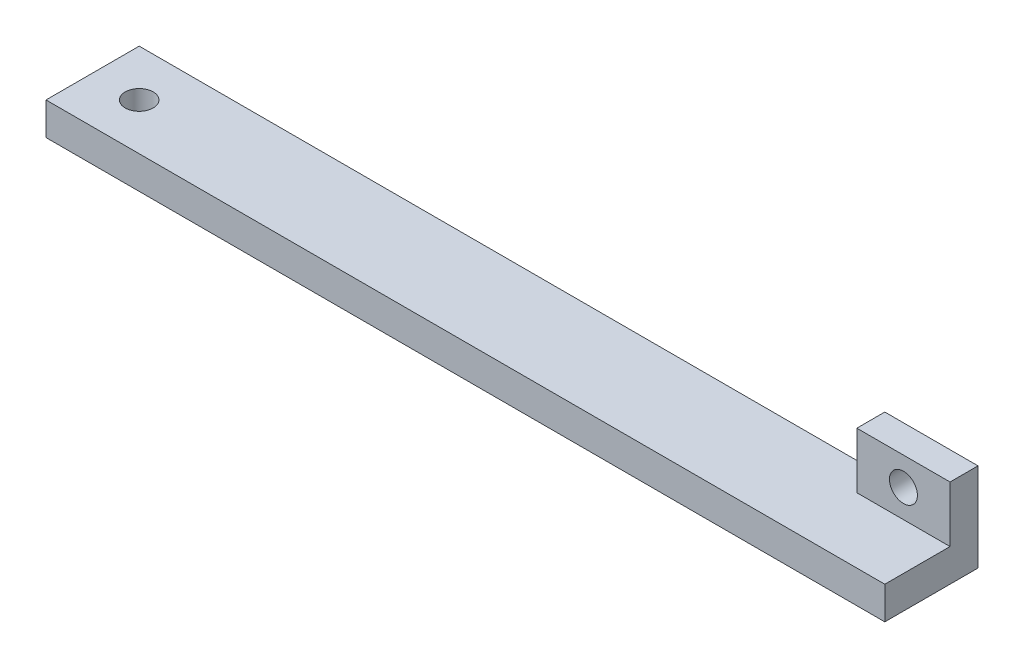
ISO-10303-21;
HEADER;
FILE_DESCRIPTION(('STEP AP214'),'2;1');
FILE_NAME('part.step','',(''),(''),'','','');
FILE_SCHEMA(('AUTOMOTIVE_DESIGN { 1 0 10303 214 1 1 1 1 }'));
ENDSEC;
DATA;
#1=APPLICATION_CONTEXT('core data for automotive mechanical design processes');
#2=APPLICATION_PROTOCOL_DEFINITION('international standard','automotive_design',2000,#1);
#3=PRODUCT_CONTEXT('',#1,'mechanical');
#4=PRODUCT('Part','Part','',(#3));
#5=PRODUCT_RELATED_PRODUCT_CATEGORY('part','',(#4));
#6=PRODUCT_DEFINITION_FORMATION('','',#4);
#7=PRODUCT_DEFINITION_CONTEXT('part definition',#1,'design');
#8=PRODUCT_DEFINITION('design','',#6,#7);
#9=PRODUCT_DEFINITION_SHAPE('','',#8);
#10=(LENGTH_UNIT() NAMED_UNIT(*) SI_UNIT(.MILLI.,.METRE.));
#11=(NAMED_UNIT(*) PLANE_ANGLE_UNIT() SI_UNIT($,.RADIAN.));
#12=(NAMED_UNIT(*) SI_UNIT($,.STERADIAN.) SOLID_ANGLE_UNIT());
#13=UNCERTAINTY_MEASURE_WITH_UNIT(LENGTH_MEASURE(1.E-05),#10,'distance_accuracy_value','');
#14=(GEOMETRIC_REPRESENTATION_CONTEXT(3) GLOBAL_UNCERTAINTY_ASSIGNED_CONTEXT((#13)) GLOBAL_UNIT_ASSIGNED_CONTEXT((#10,
#11,#12)) REPRESENTATION_CONTEXT('',''));
#15=CARTESIAN_POINT('',(0.,0.,0.));
#16=DIRECTION('',(0.,0.,1.));
#17=DIRECTION('',(1.,0.,0.));
#18=AXIS2_PLACEMENT_3D('',#15,#16,#17);
#19=CARTESIAN_POINT('',(0.,3.5,0.));
#20=DIRECTION('',(0.,1.,0.));
#21=DIRECTION('',(0.,0.,1.));
#22=AXIS2_PLACEMENT_3D('',#19,#20,#21);
#23=PLANE('',#22);
#24=DIRECTION('',(1.,0.,0.));
#25=VECTOR('',#24,1.);
#26=CARTESIAN_POINT('',(45.,3.5,-2.));
#27=LINE('',#26,#25);
#28=CARTESIAN_POINT('',(35.,3.5,-2.));
#29=VERTEX_POINT('',#28);
#30=CARTESIAN_POINT('',(45.,3.5,-2.));
#31=VERTEX_POINT('',#30);
#32=EDGE_CURVE('E121',#29,#31,#27,.T.);
#33=ORIENTED_EDGE('',*,*,#32,.F.);
#34=DIRECTION('',(0.,0.,1.));
#35=VECTOR('',#34,1.);
#36=CARTESIAN_POINT('',(35.,3.5,-5.));
#37=LINE('',#36,#35);
#38=CARTESIAN_POINT('',(35.,3.5,-5.));
#39=VERTEX_POINT('',#38);
#40=EDGE_CURVE('E55',#39,#29,#37,.T.);
#41=ORIENTED_EDGE('',*,*,#40,.F.);
#42=DIRECTION('',(-1.,0.,0.));
#43=VECTOR('',#42,1.);
#44=CARTESIAN_POINT('',(-45.,3.5,-5.));
#45=LINE('',#44,#43);
#46=CARTESIAN_POINT('',(-45.,3.5,-5.));
#47=VERTEX_POINT('',#46);
#48=EDGE_CURVE('E155',#39,#47,#45,.T.);
#49=ORIENTED_EDGE('',*,*,#48,.T.);
#50=DIRECTION('',(0.,0.,1.));
#51=VECTOR('',#50,1.);
#52=CARTESIAN_POINT('',(-45.,3.5,-5.));
#53=LINE('',#52,#51);
#54=CARTESIAN_POINT('',(-45.,3.5,5.));
#55=VERTEX_POINT('',#54);
#56=EDGE_CURVE('E159',#47,#55,#53,.T.);
#57=ORIENTED_EDGE('',*,*,#56,.T.);
#58=DIRECTION('',(1.,0.,0.));
#59=VECTOR('',#58,1.);
#60=CARTESIAN_POINT('',(-45.,3.5,5.));
#61=LINE('',#60,#59);
#62=CARTESIAN_POINT('',(45.,3.5,5.));
#63=VERTEX_POINT('',#62);
#64=EDGE_CURVE('E162',#55,#63,#61,.T.);
#65=ORIENTED_EDGE('',*,*,#64,.T.);
#66=DIRECTION('',(0.,0.,-1.));
#67=VECTOR('',#66,1.);
#68=CARTESIAN_POINT('',(45.,3.5,-5.));
#69=LINE('',#68,#67);
#70=EDGE_CURVE('E61',#63,#31,#69,.T.);
#71=ORIENTED_EDGE('',*,*,#70,.T.);
#72=EDGE_LOOP('',(#33,#41,#49,#57,#65,#71));
#73=FACE_BOUND('',#72,.T.);
#74=CARTESIAN_POINT('',(-40.,3.5,0.));
#75=DIRECTION('',(0.,1.,0.));
#76=DIRECTION('',(0.,0.,1.));
#77=AXIS2_PLACEMENT_3D('',#74,#75,#76);
#78=CIRCLE('',#77,1.5);
#79=CARTESIAN_POINT('',(-40.,3.5,1.5));
#80=VERTEX_POINT('',#79);
#81=EDGE_CURVE('E146',#80,#80,#78,.T.);
#82=ORIENTED_EDGE('',*,*,#81,.F.);
#83=EDGE_LOOP('',(#82));
#84=FACE_BOUND('',#83,.T.);
#85=ADVANCED_FACE('F39',(#73,#84),#23,.T.);
#86=CARTESIAN_POINT('',(0.,0.,0.));
#87=DIRECTION('',(0.,1.,0.));
#88=DIRECTION('',(0.,0.,1.));
#89=AXIS2_PLACEMENT_3D('',#86,#87,#88);
#90=PLANE('',#89);
#91=DIRECTION('',(0.,0.,-1.));
#92=VECTOR('',#91,1.);
#93=CARTESIAN_POINT('',(45.,0.,-5.));
#94=LINE('',#93,#92);
#95=CARTESIAN_POINT('',(45.,0.,5.));
#96=VERTEX_POINT('',#95);
#97=CARTESIAN_POINT('',(45.,0.,-5.));
#98=VERTEX_POINT('',#97);
#99=EDGE_CURVE('E104',#96,#98,#94,.T.);
#100=ORIENTED_EDGE('',*,*,#99,.F.);
#101=DIRECTION('',(1.,0.,0.));
#102=VECTOR('',#101,1.);
#103=CARTESIAN_POINT('',(-45.,0.,5.));
#104=LINE('',#103,#102);
#105=CARTESIAN_POINT('',(-45.,0.,5.));
#106=VERTEX_POINT('',#105);
#107=EDGE_CURVE('E156',#106,#96,#104,.T.);
#108=ORIENTED_EDGE('',*,*,#107,.F.);
#109=DIRECTION('',(0.,0.,1.));
#110=VECTOR('',#109,1.);
#111=CARTESIAN_POINT('',(-45.,0.,-5.));
#112=LINE('',#111,#110);
#113=CARTESIAN_POINT('',(-45.,0.,-5.));
#114=VERTEX_POINT('',#113);
#115=EDGE_CURVE('E171',#114,#106,#112,.T.);
#116=ORIENTED_EDGE('',*,*,#115,.F.);
#117=DIRECTION('',(-1.,0.,0.));
#118=VECTOR('',#117,1.);
#119=CARTESIAN_POINT('',(-45.,0.,-5.));
#120=LINE('',#119,#118);
#121=EDGE_CURVE('E168',#98,#114,#120,.T.);
#122=ORIENTED_EDGE('',*,*,#121,.F.);
#123=EDGE_LOOP('',(#100,#108,#116,#122));
#124=FACE_BOUND('',#123,.T.);
#125=CARTESIAN_POINT('',(-40.,0.,0.));
#126=DIRECTION('',(0.,1.,0.));
#127=DIRECTION('',(0.,0.,1.));
#128=AXIS2_PLACEMENT_3D('',#125,#126,#127);
#129=CIRCLE('',#128,1.5);
#130=CARTESIAN_POINT('',(-40.,0.,1.5));
#131=VERTEX_POINT('',#130);
#132=EDGE_CURVE('E145',#131,#131,#129,.T.);
#133=ORIENTED_EDGE('',*,*,#132,.T.);
#134=EDGE_LOOP('',(#133));
#135=FACE_BOUND('',#134,.T.);
#136=ADVANCED_FACE('F191',(#124,#135),#90,.F.);
#137=CARTESIAN_POINT('',(45.,3.5,-5.));
#138=DIRECTION('',(-1.,0.,0.));
#139=DIRECTION('',(0.,0.,1.));
#140=AXIS2_PLACEMENT_3D('',#137,#138,#139);
#141=PLANE('',#140);
#142=ORIENTED_EDGE('',*,*,#99,.T.);
#143=DIRECTION('',(0.,-1.,0.));
#144=VECTOR('',#143,1.);
#145=CARTESIAN_POINT('',(45.,3.5,-5.));
#146=LINE('',#145,#144);
#147=CARTESIAN_POINT('',(45.,9.5,-5.));
#148=VERTEX_POINT('',#147);
#149=EDGE_CURVE('E11',#148,#98,#146,.T.);
#150=ORIENTED_EDGE('',*,*,#149,.F.);
#151=DIRECTION('',(0.,0.,-1.));
#152=VECTOR('',#151,1.);
#153=CARTESIAN_POINT('',(45.,9.5,-5.));
#154=LINE('',#153,#152);
#155=CARTESIAN_POINT('',(45.,9.5,-2.));
#156=VERTEX_POINT('',#155);
#157=EDGE_CURVE('E101',#156,#148,#154,.T.);
#158=ORIENTED_EDGE('',*,*,#157,.F.);
#159=DIRECTION('',(0.,-1.,0.));
#160=VECTOR('',#159,1.);
#161=CARTESIAN_POINT('',(45.,9.5,-2.));
#162=LINE('',#161,#160);
#163=EDGE_CURVE('E133',#156,#31,#162,.T.);
#164=ORIENTED_EDGE('',*,*,#163,.T.);
#165=ORIENTED_EDGE('',*,*,#70,.F.);
#166=DIRECTION('',(0.,-1.,0.));
#167=VECTOR('',#166,1.);
#168=CARTESIAN_POINT('',(45.,3.5,5.));
#169=LINE('',#168,#167);
#170=EDGE_CURVE('E165',#63,#96,#169,.T.);
#171=ORIENTED_EDGE('',*,*,#170,.T.);
#172=EDGE_LOOP('',(#142,#150,#158,#164,#165,#171));
#173=FACE_BOUND('',#172,.T.);
#174=ADVANCED_FACE('F41',(#173),#141,.F.);
#175=CARTESIAN_POINT('',(-45.,3.5,-5.));
#176=DIRECTION('',(0.,0.,1.));
#177=DIRECTION('',(1.,0.,0.));
#178=AXIS2_PLACEMENT_3D('',#175,#176,#177);
#179=PLANE('',#178);
#180=CARTESIAN_POINT('',(40.,6.5,-5.));
#181=DIRECTION('',(0.,0.,1.));
#182=DIRECTION('',(1.,0.,0.));
#183=AXIS2_PLACEMENT_3D('',#180,#181,#182);
#184=CIRCLE('',#183,1.5);
#185=CARTESIAN_POINT('',(41.5,6.5,-5.));
#186=VERTEX_POINT('',#185);
#187=EDGE_CURVE('E135',#186,#186,#184,.T.);
#188=ORIENTED_EDGE('',*,*,#187,.T.);
#189=EDGE_LOOP('',(#188));
#190=FACE_BOUND('',#189,.T.);
#191=ORIENTED_EDGE('',*,*,#121,.T.);
#192=DIRECTION('',(0.,-1.,0.));
#193=VECTOR('',#192,1.);
#194=CARTESIAN_POINT('',(-45.,3.5,-5.));
#195=LINE('',#194,#193);
#196=EDGE_CURVE('E48',#47,#114,#195,.T.);
#197=ORIENTED_EDGE('',*,*,#196,.F.);
#198=ORIENTED_EDGE('',*,*,#48,.F.);
#199=DIRECTION('',(0.,-1.,0.));
#200=VECTOR('',#199,1.);
#201=CARTESIAN_POINT('',(35.,9.5,-5.));
#202=LINE('',#201,#200);
#203=CARTESIAN_POINT('',(35.,9.5,-5.));
#204=VERTEX_POINT('',#203);
#205=EDGE_CURVE('E110',#204,#39,#202,.T.);
#206=ORIENTED_EDGE('',*,*,#205,.F.);
#207=DIRECTION('',(-1.,0.,0.));
#208=VECTOR('',#207,1.);
#209=CARTESIAN_POINT('',(45.,9.5,-5.));
#210=LINE('',#209,#208);
#211=EDGE_CURVE('E107',#148,#204,#210,.T.);
#212=ORIENTED_EDGE('',*,*,#211,.F.);
#213=ORIENTED_EDGE('',*,*,#149,.T.);
#214=EDGE_LOOP('',(#191,#197,#198,#206,#212,#213));
#215=FACE_BOUND('',#214,.T.);
#216=ADVANCED_FACE('F108',(#190,#215),#179,.F.);
#217=CARTESIAN_POINT('',(-45.,3.5,-5.));
#218=DIRECTION('',(1.,0.,0.));
#219=DIRECTION('',(0.,0.,-1.));
#220=AXIS2_PLACEMENT_3D('',#217,#218,#219);
#221=PLANE('',#220);
#222=ORIENTED_EDGE('',*,*,#115,.T.);
#223=DIRECTION('',(0.,-1.,0.));
#224=VECTOR('',#223,1.);
#225=CARTESIAN_POINT('',(-45.,3.5,5.));
#226=LINE('',#225,#224);
#227=EDGE_CURVE('E178',#55,#106,#226,.T.);
#228=ORIENTED_EDGE('',*,*,#227,.F.);
#229=ORIENTED_EDGE('',*,*,#56,.F.);
#230=ORIENTED_EDGE('',*,*,#196,.T.);
#231=EDGE_LOOP('',(#222,#228,#229,#230));
#232=FACE_BOUND('',#231,.T.);
#233=ADVANCED_FACE('F187',(#232),#221,.F.);
#234=CARTESIAN_POINT('',(-45.,3.5,5.));
#235=DIRECTION('',(0.,0.,-1.));
#236=DIRECTION('',(-1.,0.,0.));
#237=AXIS2_PLACEMENT_3D('',#234,#235,#236);
#238=PLANE('',#237);
#239=ORIENTED_EDGE('',*,*,#107,.T.);
#240=ORIENTED_EDGE('',*,*,#170,.F.);
#241=ORIENTED_EDGE('',*,*,#64,.F.);
#242=ORIENTED_EDGE('',*,*,#227,.T.);
#243=EDGE_LOOP('',(#239,#240,#241,#242));
#244=FACE_BOUND('',#243,.T.);
#245=ADVANCED_FACE('F195',(#244),#238,.F.);
#246=CARTESIAN_POINT('',(-40.,3.5,0.));
#247=DIRECTION('',(0.,-1.,0.));
#248=DIRECTION('',(0.,0.,-1.));
#249=AXIS2_PLACEMENT_3D('',#246,#247,#248);
#250=CYLINDRICAL_SURFACE('',#249,1.5);
#251=ORIENTED_EDGE('',*,*,#81,.T.);
#252=EDGE_LOOP('',(#251));
#253=FACE_BOUND('',#252,.T.);
#254=ORIENTED_EDGE('',*,*,#132,.F.);
#255=EDGE_LOOP('',(#254));
#256=FACE_BOUND('',#255,.T.);
#257=ADVANCED_FACE('F204',(#253,#256),#250,.F.);
#258=CARTESIAN_POINT('',(35.,9.5,-5.));
#259=DIRECTION('',(1.,0.,0.));
#260=DIRECTION('',(0.,0.,-1.));
#261=AXIS2_PLACEMENT_3D('',#258,#259,#260);
#262=PLANE('',#261);
#263=ORIENTED_EDGE('',*,*,#40,.T.);
#264=DIRECTION('',(0.,-1.,0.));
#265=VECTOR('',#264,1.);
#266=CARTESIAN_POINT('',(35.,9.5,-2.));
#267=LINE('',#266,#265);
#268=CARTESIAN_POINT('',(35.,9.5,-2.));
#269=VERTEX_POINT('',#268);
#270=EDGE_CURVE('E139',#269,#29,#267,.T.);
#271=ORIENTED_EDGE('',*,*,#270,.F.);
#272=DIRECTION('',(0.,0.,1.));
#273=VECTOR('',#272,1.);
#274=CARTESIAN_POINT('',(35.,9.5,-5.));
#275=LINE('',#274,#273);
#276=EDGE_CURVE('E114',#204,#269,#275,.T.);
#277=ORIENTED_EDGE('',*,*,#276,.F.);
#278=ORIENTED_EDGE('',*,*,#205,.T.);
#279=EDGE_LOOP('',(#263,#271,#277,#278));
#280=FACE_BOUND('',#279,.T.);
#281=ADVANCED_FACE('F202',(#280),#262,.F.);
#282=CARTESIAN_POINT('',(45.,9.5,-2.));
#283=DIRECTION('',(0.,0.,-1.));
#284=DIRECTION('',(-1.,0.,0.));
#285=AXIS2_PLACEMENT_3D('',#282,#283,#284);
#286=PLANE('',#285);
#287=CARTESIAN_POINT('',(40.,6.5,-2.));
#288=DIRECTION('',(0.,0.,1.));
#289=DIRECTION('',(1.,0.,0.));
#290=AXIS2_PLACEMENT_3D('',#287,#288,#289);
#291=CIRCLE('',#290,1.5);
#292=CARTESIAN_POINT('',(41.5,6.5,-2.));
#293=VERTEX_POINT('',#292);
#294=EDGE_CURVE('E126',#293,#293,#291,.T.);
#295=ORIENTED_EDGE('',*,*,#294,.F.);
#296=EDGE_LOOP('',(#295));
#297=FACE_BOUND('',#296,.T.);
#298=ORIENTED_EDGE('',*,*,#32,.T.);
#299=ORIENTED_EDGE('',*,*,#163,.F.);
#300=DIRECTION('',(1.,0.,0.));
#301=VECTOR('',#300,1.);
#302=CARTESIAN_POINT('',(45.,9.5,-2.));
#303=LINE('',#302,#301);
#304=EDGE_CURVE('E118',#269,#156,#303,.T.);
#305=ORIENTED_EDGE('',*,*,#304,.F.);
#306=ORIENTED_EDGE('',*,*,#270,.T.);
#307=EDGE_LOOP('',(#298,#299,#305,#306));
#308=FACE_BOUND('',#307,.T.);
#309=ADVANCED_FACE('F198',(#297,#308),#286,.F.);
#310=CARTESIAN_POINT('',(0.,9.5,0.));
#311=DIRECTION('',(0.,-1.,0.));
#312=DIRECTION('',(0.,0.,-1.));
#313=AXIS2_PLACEMENT_3D('',#310,#311,#312);
#314=PLANE('',#313);
#315=ORIENTED_EDGE('',*,*,#157,.T.);
#316=ORIENTED_EDGE('',*,*,#211,.T.);
#317=ORIENTED_EDGE('',*,*,#276,.T.);
#318=ORIENTED_EDGE('',*,*,#304,.T.);
#319=EDGE_LOOP('',(#315,#316,#317,#318));
#320=FACE_BOUND('',#319,.T.);
#321=ADVANCED_FACE('F116',(#320),#314,.F.);
#322=CARTESIAN_POINT('',(40.,6.5,-5.));
#323=DIRECTION('',(0.,0.,1.));
#324=DIRECTION('',(1.,0.,0.));
#325=AXIS2_PLACEMENT_3D('',#322,#323,#324);
#326=CYLINDRICAL_SURFACE('',#325,1.5);
#327=ORIENTED_EDGE('',*,*,#187,.F.);
#328=EDGE_LOOP('',(#327));
#329=FACE_BOUND('',#328,.T.);
#330=ORIENTED_EDGE('',*,*,#294,.T.);
#331=EDGE_LOOP('',(#330));
#332=FACE_BOUND('',#331,.T.);
#333=ADVANCED_FACE('F237',(#329,#332),#326,.F.);
#334=CLOSED_SHELL('',(#85,#136,#174,#216,#233,#245,#257,#281,#309,#321,#333));
#335=MANIFOLD_SOLID_BREP('B2',#334);
#336=ADVANCED_BREP_SHAPE_REPRESENTATION('',(#18,#335),#14);
#337=SHAPE_DEFINITION_REPRESENTATION(#9,#336);
ENDSEC;
END-ISO-10303-21;
